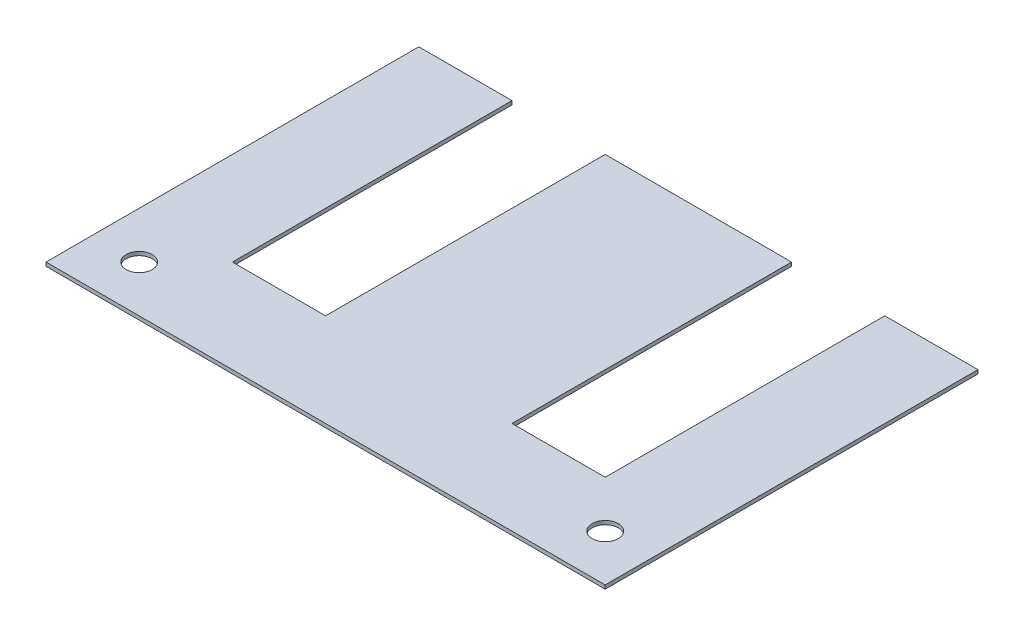
ISO-10303-21;
HEADER;
FILE_DESCRIPTION(('STEP AP214'),'2;1');
FILE_NAME('part.step','',(''),(''),'','','');
FILE_SCHEMA(('AUTOMOTIVE_DESIGN { 1 0 10303 214 1 1 1 1 }'));
ENDSEC;
DATA;
#1=APPLICATION_CONTEXT('core data for automotive mechanical design processes');
#2=APPLICATION_PROTOCOL_DEFINITION('international standard','automotive_design',2000,#1);
#3=PRODUCT_CONTEXT('',#1,'mechanical');
#4=PRODUCT('Part','Part','',(#3));
#5=PRODUCT_RELATED_PRODUCT_CATEGORY('part','',(#4));
#6=PRODUCT_DEFINITION_FORMATION('','',#4);
#7=PRODUCT_DEFINITION_CONTEXT('part definition',#1,'design');
#8=PRODUCT_DEFINITION('design','',#6,#7);
#9=PRODUCT_DEFINITION_SHAPE('','',#8);
#10=(LENGTH_UNIT() NAMED_UNIT(*) SI_UNIT(.MILLI.,.METRE.));
#11=(NAMED_UNIT(*) PLANE_ANGLE_UNIT() SI_UNIT($,.RADIAN.));
#12=(NAMED_UNIT(*) SI_UNIT($,.STERADIAN.) SOLID_ANGLE_UNIT());
#13=UNCERTAINTY_MEASURE_WITH_UNIT(LENGTH_MEASURE(1.E-05),#10,'distance_accuracy_value','');
#14=(GEOMETRIC_REPRESENTATION_CONTEXT(3) GLOBAL_UNCERTAINTY_ASSIGNED_CONTEXT((#13)) GLOBAL_UNIT_ASSIGNED_CONTEXT((#10,
#11,#12)) REPRESENTATION_CONTEXT('',''));
#15=CARTESIAN_POINT('',(0.,0.,0.));
#16=DIRECTION('',(0.,0.,1.));
#17=DIRECTION('',(1.,0.,0.));
#18=AXIS2_PLACEMENT_3D('',#15,#16,#17);
#19=CARTESIAN_POINT('',(0.,1.,0.));
#20=DIRECTION('',(0.,1.,0.));
#21=DIRECTION('',(0.,0.,1.));
#22=AXIS2_PLACEMENT_3D('',#19,#20,#21);
#23=PLANE('',#22);
#24=CARTESIAN_POINT('',(12.5,1.,-12.5));
#25=DIRECTION('',(0.,1.,0.));
#26=DIRECTION('',(0.,0.,1.));
#27=AXIS2_PLACEMENT_3D('',#24,#25,#26);
#28=CIRCLE('',#27,3.5);
#29=CARTESIAN_POINT('',(12.5,1.,-9.));
#30=VERTEX_POINT('',#29);
#31=EDGE_CURVE('E170',#30,#30,#28,.T.);
#32=ORIENTED_EDGE('',*,*,#31,.F.);
#33=EDGE_LOOP('',(#32));
#34=FACE_BOUND('',#33,.T.);
#35=DIRECTION('',(0.,0.,1.));
#36=VECTOR('',#35,1.);
#37=CARTESIAN_POINT('',(0.,1.,-100.));
#38=LINE('',#37,#36);
#39=CARTESIAN_POINT('',(0.,1.,-100.));
#40=VERTEX_POINT('',#39);
#41=CARTESIAN_POINT('',(0.,1.,0.));
#42=VERTEX_POINT('',#41);
#43=EDGE_CURVE('E200',#40,#42,#38,.T.);
#44=ORIENTED_EDGE('',*,*,#43,.T.);
#45=DIRECTION('',(1.,0.,0.));
#46=VECTOR('',#45,1.);
#47=CARTESIAN_POINT('',(0.,1.,0.));
#48=LINE('',#47,#46);
#49=CARTESIAN_POINT('',(150.,1.,0.));
#50=VERTEX_POINT('',#49);
#51=EDGE_CURVE('E112',#42,#50,#48,.T.);
#52=ORIENTED_EDGE('',*,*,#51,.T.);
#53=DIRECTION('',(0.,0.,-1.));
#54=VECTOR('',#53,1.);
#55=CARTESIAN_POINT('',(150.,1.,0.));
#56=LINE('',#55,#54);
#57=CARTESIAN_POINT('',(150.,1.,-100.));
#58=VERTEX_POINT('',#57);
#59=EDGE_CURVE('E237',#50,#58,#56,.T.);
#60=ORIENTED_EDGE('',*,*,#59,.T.);
#61=DIRECTION('',(-1.,0.,0.));
#62=VECTOR('',#61,1.);
#63=CARTESIAN_POINT('',(150.,1.,-100.));
#64=LINE('',#63,#62);
#65=CARTESIAN_POINT('',(125.,1.,-100.));
#66=VERTEX_POINT('',#65);
#67=EDGE_CURVE('E257',#58,#66,#64,.T.);
#68=ORIENTED_EDGE('',*,*,#67,.T.);
#69=DIRECTION('',(0.,0.,1.));
#70=VECTOR('',#69,1.);
#71=CARTESIAN_POINT('',(125.,1.,-100.));
#72=LINE('',#71,#70);
#73=CARTESIAN_POINT('',(125.,1.,-25.));
#74=VERTEX_POINT('',#73);
#75=EDGE_CURVE('E253',#66,#74,#72,.T.);
#76=ORIENTED_EDGE('',*,*,#75,.T.);
#77=DIRECTION('',(-1.,0.,0.));
#78=VECTOR('',#77,1.);
#79=CARTESIAN_POINT('',(125.,1.,-25.));
#80=LINE('',#79,#78);
#81=CARTESIAN_POINT('',(100.,1.,-25.));
#82=VERTEX_POINT('',#81);
#83=EDGE_CURVE('E256',#74,#82,#80,.T.);
#84=ORIENTED_EDGE('',*,*,#83,.T.);
#85=DIRECTION('',(0.,0.,-1.));
#86=VECTOR('',#85,1.);
#87=CARTESIAN_POINT('',(100.,1.,-25.));
#88=LINE('',#87,#86);
#89=CARTESIAN_POINT('',(100.,1.,-100.));
#90=VERTEX_POINT('',#89);
#91=EDGE_CURVE('E261',#82,#90,#88,.T.);
#92=ORIENTED_EDGE('',*,*,#91,.T.);
#93=DIRECTION('',(-1.,0.,0.));
#94=VECTOR('',#93,1.);
#95=CARTESIAN_POINT('',(100.,1.,-100.));
#96=LINE('',#95,#94);
#97=CARTESIAN_POINT('',(50.,1.,-100.));
#98=VERTEX_POINT('',#97);
#99=EDGE_CURVE('E268',#90,#98,#96,.T.);
#100=ORIENTED_EDGE('',*,*,#99,.T.);
#101=DIRECTION('',(0.,0.,1.));
#102=VECTOR('',#101,1.);
#103=CARTESIAN_POINT('',(50.,1.,-100.));
#104=LINE('',#103,#102);
#105=CARTESIAN_POINT('',(50.,1.,-25.));
#106=VERTEX_POINT('',#105);
#107=EDGE_CURVE('E143',#98,#106,#104,.T.);
#108=ORIENTED_EDGE('',*,*,#107,.T.);
#109=DIRECTION('',(-1.,0.,0.));
#110=VECTOR('',#109,1.);
#111=CARTESIAN_POINT('',(50.,1.,-25.));
#112=LINE('',#111,#110);
#113=CARTESIAN_POINT('',(25.,1.,-25.));
#114=VERTEX_POINT('',#113);
#115=EDGE_CURVE('E137',#106,#114,#112,.T.);
#116=ORIENTED_EDGE('',*,*,#115,.T.);
#117=DIRECTION('',(0.,0.,-1.));
#118=VECTOR('',#117,1.);
#119=CARTESIAN_POINT('',(25.,1.,-25.));
#120=LINE('',#119,#118);
#121=CARTESIAN_POINT('',(25.,1.,-100.));
#122=VERTEX_POINT('',#121);
#123=EDGE_CURVE('E141',#114,#122,#120,.T.);
#124=ORIENTED_EDGE('',*,*,#123,.T.);
#125=DIRECTION('',(-1.,0.,0.));
#126=VECTOR('',#125,1.);
#127=CARTESIAN_POINT('',(25.,1.,-100.));
#128=LINE('',#127,#126);
#129=EDGE_CURVE('E57',#122,#40,#128,.T.);
#130=ORIENTED_EDGE('',*,*,#129,.T.);
#131=EDGE_LOOP('',(#44,#52,#60,#68,#76,#84,#92,#100,#108,#116,#124,#130));
#132=FACE_BOUND('',#131,.T.);
#133=CARTESIAN_POINT('',(137.5,1.,-12.5));
#134=DIRECTION('',(0.,1.,0.));
#135=DIRECTION('',(0.,0.,1.));
#136=AXIS2_PLACEMENT_3D('',#133,#134,#135);
#137=CIRCLE('',#136,3.49999999999999);
#138=CARTESIAN_POINT('',(137.5,1.,-9.00000000000001));
#139=VERTEX_POINT('',#138);
#140=EDGE_CURVE('E312',#139,#139,#137,.T.);
#141=ORIENTED_EDGE('',*,*,#140,.F.);
#142=EDGE_LOOP('',(#141));
#143=FACE_BOUND('',#142,.T.);
#144=ADVANCED_FACE('F39',(#34,#132,#143),#23,.T.);
#145=CARTESIAN_POINT('',(0.,0.,0.));
#146=DIRECTION('',(0.,1.,0.));
#147=DIRECTION('',(0.,0.,1.));
#148=AXIS2_PLACEMENT_3D('',#145,#146,#147);
#149=PLANE('',#148);
#150=DIRECTION('',(0.,0.,1.));
#151=VECTOR('',#150,1.);
#152=CARTESIAN_POINT('',(0.,0.,-100.));
#153=LINE('',#152,#151);
#154=CARTESIAN_POINT('',(0.,0.,-100.));
#155=VERTEX_POINT('',#154);
#156=CARTESIAN_POINT('',(0.,0.,0.));
#157=VERTEX_POINT('',#156);
#158=EDGE_CURVE('E165',#155,#157,#153,.T.);
#159=ORIENTED_EDGE('',*,*,#158,.F.);
#160=DIRECTION('',(-1.,0.,0.));
#161=VECTOR('',#160,1.);
#162=CARTESIAN_POINT('',(25.,0.,-100.));
#163=LINE('',#162,#161);
#164=CARTESIAN_POINT('',(25.,0.,-100.));
#165=VERTEX_POINT('',#164);
#166=EDGE_CURVE('E104',#165,#155,#163,.T.);
#167=ORIENTED_EDGE('',*,*,#166,.F.);
#168=DIRECTION('',(0.,0.,-1.));
#169=VECTOR('',#168,1.);
#170=CARTESIAN_POINT('',(25.,0.,-25.));
#171=LINE('',#170,#169);
#172=CARTESIAN_POINT('',(25.,0.,-25.));
#173=VERTEX_POINT('',#172);
#174=EDGE_CURVE('E98',#173,#165,#171,.T.);
#175=ORIENTED_EDGE('',*,*,#174,.F.);
#176=DIRECTION('',(-1.,0.,0.));
#177=VECTOR('',#176,1.);
#178=CARTESIAN_POINT('',(50.,0.,-25.));
#179=LINE('',#178,#177);
#180=CARTESIAN_POINT('',(50.,0.,-25.));
#181=VERTEX_POINT('',#180);
#182=EDGE_CURVE('E152',#181,#173,#179,.T.);
#183=ORIENTED_EDGE('',*,*,#182,.F.);
#184=DIRECTION('',(0.,0.,1.));
#185=VECTOR('',#184,1.);
#186=CARTESIAN_POINT('',(50.,0.,-100.));
#187=LINE('',#186,#185);
#188=CARTESIAN_POINT('',(50.,0.,-100.));
#189=VERTEX_POINT('',#188);
#190=EDGE_CURVE('E191',#189,#181,#187,.T.);
#191=ORIENTED_EDGE('',*,*,#190,.F.);
#192=DIRECTION('',(-1.,0.,0.));
#193=VECTOR('',#192,1.);
#194=CARTESIAN_POINT('',(100.,0.,-100.));
#195=LINE('',#194,#193);
#196=CARTESIAN_POINT('',(100.,0.,-100.));
#197=VERTEX_POINT('',#196);
#198=EDGE_CURVE('E188',#197,#189,#195,.T.);
#199=ORIENTED_EDGE('',*,*,#198,.F.);
#200=DIRECTION('',(0.,0.,-1.));
#201=VECTOR('',#200,1.);
#202=CARTESIAN_POINT('',(100.,0.,-25.));
#203=LINE('',#202,#201);
#204=CARTESIAN_POINT('',(100.,0.,-25.));
#205=VERTEX_POINT('',#204);
#206=EDGE_CURVE('E185',#205,#197,#203,.T.);
#207=ORIENTED_EDGE('',*,*,#206,.F.);
#208=DIRECTION('',(-1.,0.,0.));
#209=VECTOR('',#208,1.);
#210=CARTESIAN_POINT('',(125.,0.,-25.));
#211=LINE('',#210,#209);
#212=CARTESIAN_POINT('',(125.,0.,-25.));
#213=VERTEX_POINT('',#212);
#214=EDGE_CURVE('E182',#213,#205,#211,.T.);
#215=ORIENTED_EDGE('',*,*,#214,.F.);
#216=DIRECTION('',(0.,0.,1.));
#217=VECTOR('',#216,1.);
#218=CARTESIAN_POINT('',(125.,0.,-100.));
#219=LINE('',#218,#217);
#220=CARTESIAN_POINT('',(125.,0.,-100.));
#221=VERTEX_POINT('',#220);
#222=EDGE_CURVE('E179',#221,#213,#219,.T.);
#223=ORIENTED_EDGE('',*,*,#222,.F.);
#224=DIRECTION('',(-1.,0.,0.));
#225=VECTOR('',#224,1.);
#226=CARTESIAN_POINT('',(150.,0.,-100.));
#227=LINE('',#226,#225);
#228=CARTESIAN_POINT('',(150.,0.,-100.));
#229=VERTEX_POINT('',#228);
#230=EDGE_CURVE('E176',#229,#221,#227,.T.);
#231=ORIENTED_EDGE('',*,*,#230,.F.);
#232=DIRECTION('',(0.,0.,-1.));
#233=VECTOR('',#232,1.);
#234=CARTESIAN_POINT('',(150.,0.,0.));
#235=LINE('',#234,#233);
#236=CARTESIAN_POINT('',(150.,0.,0.));
#237=VERTEX_POINT('',#236);
#238=EDGE_CURVE('E173',#237,#229,#235,.T.);
#239=ORIENTED_EDGE('',*,*,#238,.F.);
#240=DIRECTION('',(1.,0.,0.));
#241=VECTOR('',#240,1.);
#242=CARTESIAN_POINT('',(0.,0.,0.));
#243=LINE('',#242,#241);
#244=EDGE_CURVE('E169',#157,#237,#243,.T.);
#245=ORIENTED_EDGE('',*,*,#244,.F.);
#246=EDGE_LOOP('',(#159,#167,#175,#183,#191,#199,#207,#215,#223,#231,#239,#245));
#247=FACE_BOUND('',#246,.T.);
#248=CARTESIAN_POINT('',(12.5,0.,-12.5));
#249=DIRECTION('',(0.,1.,0.));
#250=DIRECTION('',(0.,0.,1.));
#251=AXIS2_PLACEMENT_3D('',#248,#249,#250);
#252=CIRCLE('',#251,3.5);
#253=CARTESIAN_POINT('',(12.5,0.,-9.));
#254=VERTEX_POINT('',#253);
#255=EDGE_CURVE('E320',#254,#254,#252,.T.);
#256=ORIENTED_EDGE('',*,*,#255,.T.);
#257=EDGE_LOOP('',(#256));
#258=FACE_BOUND('',#257,.T.);
#259=CARTESIAN_POINT('',(137.5,0.,-12.5));
#260=DIRECTION('',(0.,1.,0.));
#261=DIRECTION('',(0.,0.,1.));
#262=AXIS2_PLACEMENT_3D('',#259,#260,#261);
#263=CIRCLE('',#262,3.49999999999999);
#264=CARTESIAN_POINT('',(137.5,0.,-9.00000000000001));
#265=VERTEX_POINT('',#264);
#266=EDGE_CURVE('E315',#265,#265,#263,.T.);
#267=ORIENTED_EDGE('',*,*,#266,.T.);
#268=EDGE_LOOP('',(#267));
#269=FACE_BOUND('',#268,.T.);
#270=ADVANCED_FACE('F241',(#247,#258,#269),#149,.F.);
#271=CARTESIAN_POINT('',(0.,1.,-100.));
#272=DIRECTION('',(1.,0.,0.));
#273=DIRECTION('',(0.,0.,-1.));
#274=AXIS2_PLACEMENT_3D('',#271,#272,#273);
#275=PLANE('',#274);
#276=ORIENTED_EDGE('',*,*,#158,.T.);
#277=DIRECTION('',(0.,-1.,0.));
#278=VECTOR('',#277,1.);
#279=CARTESIAN_POINT('',(0.,1.,0.));
#280=LINE('',#279,#278);
#281=EDGE_CURVE('E11',#42,#157,#280,.T.);
#282=ORIENTED_EDGE('',*,*,#281,.F.);
#283=ORIENTED_EDGE('',*,*,#43,.F.);
#284=DIRECTION('',(0.,-1.,0.));
#285=VECTOR('',#284,1.);
#286=CARTESIAN_POINT('',(0.,1.,-100.));
#287=LINE('',#286,#285);
#288=EDGE_CURVE('E161',#40,#155,#287,.T.);
#289=ORIENTED_EDGE('',*,*,#288,.T.);
#290=EDGE_LOOP('',(#276,#282,#283,#289));
#291=FACE_BOUND('',#290,.T.);
#292=ADVANCED_FACE('F41',(#291),#275,.F.);
#293=CARTESIAN_POINT('',(0.,1.,0.));
#294=DIRECTION('',(0.,0.,-1.));
#295=DIRECTION('',(-1.,0.,0.));
#296=AXIS2_PLACEMENT_3D('',#293,#294,#295);
#297=PLANE('',#296);
#298=ORIENTED_EDGE('',*,*,#244,.T.);
#299=DIRECTION('',(0.,-1.,0.));
#300=VECTOR('',#299,1.);
#301=CARTESIAN_POINT('',(150.,1.,0.));
#302=LINE('',#301,#300);
#303=EDGE_CURVE('E49',#50,#237,#302,.T.);
#304=ORIENTED_EDGE('',*,*,#303,.F.);
#305=ORIENTED_EDGE('',*,*,#51,.F.);
#306=ORIENTED_EDGE('',*,*,#281,.T.);
#307=EDGE_LOOP('',(#298,#304,#305,#306));
#308=FACE_BOUND('',#307,.T.);
#309=ADVANCED_FACE('F418',(#308),#297,.F.);
#310=CARTESIAN_POINT('',(150.,1.,0.));
#311=DIRECTION('',(-1.,0.,0.));
#312=DIRECTION('',(0.,0.,1.));
#313=AXIS2_PLACEMENT_3D('',#310,#311,#312);
#314=PLANE('',#313);
#315=ORIENTED_EDGE('',*,*,#238,.T.);
#316=DIRECTION('',(0.,-1.,0.));
#317=VECTOR('',#316,1.);
#318=CARTESIAN_POINT('',(150.,1.,-100.));
#319=LINE('',#318,#317);
#320=EDGE_CURVE('E227',#58,#229,#319,.T.);
#321=ORIENTED_EDGE('',*,*,#320,.F.);
#322=ORIENTED_EDGE('',*,*,#59,.F.);
#323=ORIENTED_EDGE('',*,*,#303,.T.);
#324=EDGE_LOOP('',(#315,#321,#322,#323));
#325=FACE_BOUND('',#324,.T.);
#326=ADVANCED_FACE('F235',(#325),#314,.F.);
#327=CARTESIAN_POINT('',(150.,1.,-100.));
#328=DIRECTION('',(0.,0.,1.));
#329=DIRECTION('',(1.,0.,0.));
#330=AXIS2_PLACEMENT_3D('',#327,#328,#329);
#331=PLANE('',#330);
#332=ORIENTED_EDGE('',*,*,#230,.T.);
#333=DIRECTION('',(0.,-1.,0.));
#334=VECTOR('',#333,1.);
#335=CARTESIAN_POINT('',(125.,1.,-100.));
#336=LINE('',#335,#334);
#337=EDGE_CURVE('E223',#66,#221,#336,.T.);
#338=ORIENTED_EDGE('',*,*,#337,.F.);
#339=ORIENTED_EDGE('',*,*,#67,.F.);
#340=ORIENTED_EDGE('',*,*,#320,.T.);
#341=EDGE_LOOP('',(#332,#338,#339,#340));
#342=FACE_BOUND('',#341,.T.);
#343=ADVANCED_FACE('F247',(#342),#331,.F.);
#344=CARTESIAN_POINT('',(125.,1.,-100.));
#345=DIRECTION('',(1.,0.,0.));
#346=DIRECTION('',(0.,0.,-1.));
#347=AXIS2_PLACEMENT_3D('',#344,#345,#346);
#348=PLANE('',#347);
#349=ORIENTED_EDGE('',*,*,#222,.T.);
#350=DIRECTION('',(0.,-1.,0.));
#351=VECTOR('',#350,1.);
#352=CARTESIAN_POINT('',(125.,1.,-25.));
#353=LINE('',#352,#351);
#354=EDGE_CURVE('E219',#74,#213,#353,.T.);
#355=ORIENTED_EDGE('',*,*,#354,.F.);
#356=ORIENTED_EDGE('',*,*,#75,.F.);
#357=ORIENTED_EDGE('',*,*,#337,.T.);
#358=EDGE_LOOP('',(#349,#355,#356,#357));
#359=FACE_BOUND('',#358,.T.);
#360=ADVANCED_FACE('F251',(#359),#348,.F.);
#361=CARTESIAN_POINT('',(125.,1.,-25.));
#362=DIRECTION('',(0.,0.,1.));
#363=DIRECTION('',(1.,0.,0.));
#364=AXIS2_PLACEMENT_3D('',#361,#362,#363);
#365=PLANE('',#364);
#366=ORIENTED_EDGE('',*,*,#214,.T.);
#367=DIRECTION('',(0.,-1.,0.));
#368=VECTOR('',#367,1.);
#369=CARTESIAN_POINT('',(100.,1.,-25.));
#370=LINE('',#369,#368);
#371=EDGE_CURVE('E215',#82,#205,#370,.T.);
#372=ORIENTED_EDGE('',*,*,#371,.F.);
#373=ORIENTED_EDGE('',*,*,#83,.F.);
#374=ORIENTED_EDGE('',*,*,#354,.T.);
#375=EDGE_LOOP('',(#366,#372,#373,#374));
#376=FACE_BOUND('',#375,.T.);
#377=ADVANCED_FACE('F383',(#376),#365,.F.);
#378=CARTESIAN_POINT('',(100.,1.,-25.));
#379=DIRECTION('',(-1.,0.,0.));
#380=DIRECTION('',(0.,0.,1.));
#381=AXIS2_PLACEMENT_3D('',#378,#379,#380);
#382=PLANE('',#381);
#383=ORIENTED_EDGE('',*,*,#206,.T.);
#384=DIRECTION('',(0.,-1.,0.));
#385=VECTOR('',#384,1.);
#386=CARTESIAN_POINT('',(100.,1.,-100.));
#387=LINE('',#386,#385);
#388=EDGE_CURVE('E211',#90,#197,#387,.T.);
#389=ORIENTED_EDGE('',*,*,#388,.F.);
#390=ORIENTED_EDGE('',*,*,#91,.F.);
#391=ORIENTED_EDGE('',*,*,#371,.T.);
#392=EDGE_LOOP('',(#383,#389,#390,#391));
#393=FACE_BOUND('',#392,.T.);
#394=ADVANCED_FACE('F374',(#393),#382,.F.);
#395=CARTESIAN_POINT('',(100.,1.,-100.));
#396=DIRECTION('',(0.,0.,1.));
#397=DIRECTION('',(1.,0.,0.));
#398=AXIS2_PLACEMENT_3D('',#395,#396,#397);
#399=PLANE('',#398);
#400=ORIENTED_EDGE('',*,*,#198,.T.);
#401=DIRECTION('',(0.,-1.,0.));
#402=VECTOR('',#401,1.);
#403=CARTESIAN_POINT('',(50.,1.,-100.));
#404=LINE('',#403,#402);
#405=EDGE_CURVE('E207',#98,#189,#404,.T.);
#406=ORIENTED_EDGE('',*,*,#405,.F.);
#407=ORIENTED_EDGE('',*,*,#99,.F.);
#408=ORIENTED_EDGE('',*,*,#388,.T.);
#409=EDGE_LOOP('',(#400,#406,#407,#408));
#410=FACE_BOUND('',#409,.T.);
#411=ADVANCED_FACE('F276',(#410),#399,.F.);
#412=CARTESIAN_POINT('',(50.,1.,-100.));
#413=DIRECTION('',(1.,0.,0.));
#414=DIRECTION('',(0.,0.,-1.));
#415=AXIS2_PLACEMENT_3D('',#412,#413,#414);
#416=PLANE('',#415);
#417=ORIENTED_EDGE('',*,*,#190,.T.);
#418=DIRECTION('',(0.,-1.,0.));
#419=VECTOR('',#418,1.);
#420=CARTESIAN_POINT('',(50.,1.,-25.));
#421=LINE('',#420,#419);
#422=EDGE_CURVE('E154',#106,#181,#421,.T.);
#423=ORIENTED_EDGE('',*,*,#422,.F.);
#424=ORIENTED_EDGE('',*,*,#107,.F.);
#425=ORIENTED_EDGE('',*,*,#405,.T.);
#426=EDGE_LOOP('',(#417,#423,#424,#425));
#427=FACE_BOUND('',#426,.T.);
#428=ADVANCED_FACE('F280',(#427),#416,.F.);
#429=CARTESIAN_POINT('',(50.,1.,-25.));
#430=DIRECTION('',(0.,0.,1.));
#431=DIRECTION('',(1.,0.,0.));
#432=AXIS2_PLACEMENT_3D('',#429,#430,#431);
#433=PLANE('',#432);
#434=ORIENTED_EDGE('',*,*,#182,.T.);
#435=DIRECTION('',(0.,-1.,0.));
#436=VECTOR('',#435,1.);
#437=CARTESIAN_POINT('',(25.,1.,-25.));
#438=LINE('',#437,#436);
#439=EDGE_CURVE('E149',#114,#173,#438,.T.);
#440=ORIENTED_EDGE('',*,*,#439,.F.);
#441=ORIENTED_EDGE('',*,*,#115,.F.);
#442=ORIENTED_EDGE('',*,*,#422,.T.);
#443=EDGE_LOOP('',(#434,#440,#441,#442));
#444=FACE_BOUND('',#443,.T.);
#445=ADVANCED_FACE('F150',(#444),#433,.F.);
#446=CARTESIAN_POINT('',(25.,1.,-25.));
#447=DIRECTION('',(-1.,0.,0.));
#448=DIRECTION('',(0.,0.,1.));
#449=AXIS2_PLACEMENT_3D('',#446,#447,#448);
#450=PLANE('',#449);
#451=ORIENTED_EDGE('',*,*,#174,.T.);
#452=DIRECTION('',(0.,-1.,0.));
#453=VECTOR('',#452,1.);
#454=CARTESIAN_POINT('',(25.,1.,-100.));
#455=LINE('',#454,#453);
#456=EDGE_CURVE('E155',#122,#165,#455,.T.);
#457=ORIENTED_EDGE('',*,*,#456,.F.);
#458=ORIENTED_EDGE('',*,*,#123,.F.);
#459=ORIENTED_EDGE('',*,*,#439,.T.);
#460=EDGE_LOOP('',(#451,#457,#458,#459));
#461=FACE_BOUND('',#460,.T.);
#462=ADVANCED_FACE('F157',(#461),#450,.F.);
#463=CARTESIAN_POINT('',(25.,1.,-100.));
#464=DIRECTION('',(0.,0.,1.));
#465=DIRECTION('',(1.,0.,0.));
#466=AXIS2_PLACEMENT_3D('',#463,#464,#465);
#467=PLANE('',#466);
#468=ORIENTED_EDGE('',*,*,#166,.T.);
#469=ORIENTED_EDGE('',*,*,#288,.F.);
#470=ORIENTED_EDGE('',*,*,#129,.F.);
#471=ORIENTED_EDGE('',*,*,#456,.T.);
#472=EDGE_LOOP('',(#468,#469,#470,#471));
#473=FACE_BOUND('',#472,.T.);
#474=ADVANCED_FACE('F284',(#473),#467,.F.);
#475=CARTESIAN_POINT('',(12.5,1.,-12.5));
#476=DIRECTION('',(0.,-1.,0.));
#477=DIRECTION('',(0.,0.,-1.));
#478=AXIS2_PLACEMENT_3D('',#475,#476,#477);
#479=CYLINDRICAL_SURFACE('',#478,3.5);
#480=ORIENTED_EDGE('',*,*,#31,.T.);
#481=EDGE_LOOP('',(#480));
#482=FACE_BOUND('',#481,.T.);
#483=ORIENTED_EDGE('',*,*,#255,.F.);
#484=EDGE_LOOP('',(#483));
#485=FACE_BOUND('',#484,.T.);
#486=ADVANCED_FACE('F286',(#482,#485),#479,.F.);
#487=CARTESIAN_POINT('',(137.5,1.,-12.5));
#488=DIRECTION('',(0.,-1.,0.));
#489=DIRECTION('',(0.,0.,-1.));
#490=AXIS2_PLACEMENT_3D('',#487,#488,#489);
#491=CYLINDRICAL_SURFACE('',#490,3.49999999999999);
#492=ORIENTED_EDGE('',*,*,#140,.T.);
#493=EDGE_LOOP('',(#492));
#494=FACE_BOUND('',#493,.T.);
#495=ORIENTED_EDGE('',*,*,#266,.F.);
#496=EDGE_LOOP('',(#495));
#497=FACE_BOUND('',#496,.T.);
#498=ADVANCED_FACE('F292',(#494,#497),#491,.F.);
#499=CLOSED_SHELL('',(#144,#270,#292,#309,#326,#343,#360,#377,#394,#411,#428,#445,#462,#474,
#486,#498));
#500=MANIFOLD_SOLID_BREP('B2',#499);
#501=ADVANCED_BREP_SHAPE_REPRESENTATION('',(#18,#500),#14);
#502=SHAPE_DEFINITION_REPRESENTATION(#9,#501);
ENDSEC;
END-ISO-10303-21;
